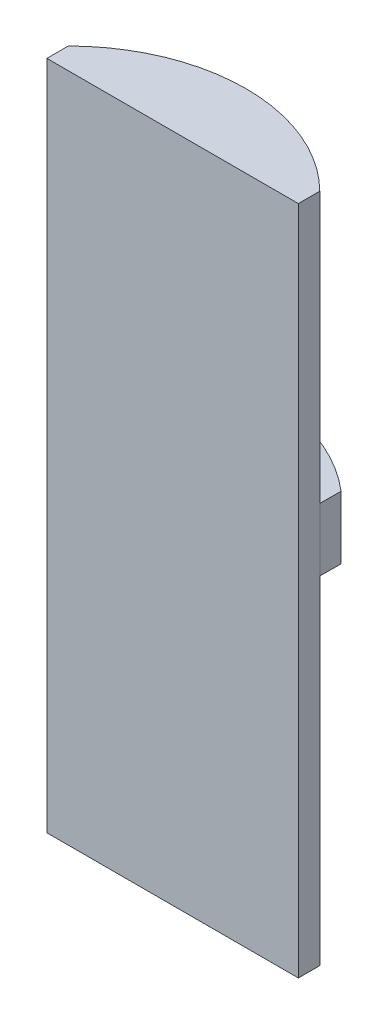
ISO-10303-21;
HEADER;
FILE_DESCRIPTION(('STEP AP214'),'2;1');
FILE_NAME('part.step','',(''),(''),'','','');
FILE_SCHEMA(('AUTOMOTIVE_DESIGN { 1 0 10303 214 1 1 1 1 }'));
ENDSEC;
DATA;
#1=APPLICATION_CONTEXT('core data for automotive mechanical design processes');
#2=APPLICATION_PROTOCOL_DEFINITION('international standard','automotive_design',2000,#1);
#3=PRODUCT_CONTEXT('',#1,'mechanical');
#4=PRODUCT('Part','Part','',(#3));
#5=PRODUCT_RELATED_PRODUCT_CATEGORY('part','',(#4));
#6=PRODUCT_DEFINITION_FORMATION('','',#4);
#7=PRODUCT_DEFINITION_CONTEXT('part definition',#1,'design');
#8=PRODUCT_DEFINITION('design','',#6,#7);
#9=PRODUCT_DEFINITION_SHAPE('','',#8);
#10=(LENGTH_UNIT() NAMED_UNIT(*) SI_UNIT(.MILLI.,.METRE.));
#11=(NAMED_UNIT(*) PLANE_ANGLE_UNIT() SI_UNIT($,.RADIAN.));
#12=(NAMED_UNIT(*) SI_UNIT($,.STERADIAN.) SOLID_ANGLE_UNIT());
#13=UNCERTAINTY_MEASURE_WITH_UNIT(LENGTH_MEASURE(1.E-05),#10,'distance_accuracy_value','');
#14=(GEOMETRIC_REPRESENTATION_CONTEXT(3) GLOBAL_UNCERTAINTY_ASSIGNED_CONTEXT((#13)) GLOBAL_UNIT_ASSIGNED_CONTEXT((#10,
#11,#12)) REPRESENTATION_CONTEXT('',''));
#15=CARTESIAN_POINT('',(0.,0.,0.));
#16=DIRECTION('',(0.,0.,1.));
#17=DIRECTION('',(1.,0.,0.));
#18=AXIS2_PLACEMENT_3D('',#15,#16,#17);
#19=CARTESIAN_POINT('',(0.,29.,0.));
#20=DIRECTION('',(0.,-1.,0.));
#21=DIRECTION('',(0.,0.,-1.));
#22=AXIS2_PLACEMENT_3D('',#19,#20,#21);
#23=CYLINDRICAL_SURFACE('',#22,8.5);
#24=CARTESIAN_POINT('',(0.,2.,0.));
#25=DIRECTION('',(0.,-1.,0.));
#26=DIRECTION('',(0.,0.,-1.));
#27=AXIS2_PLACEMENT_3D('',#24,#25,#26);
#28=CIRCLE('',#27,8.5);
#29=CARTESIAN_POINT('',(-6.,2.,-6.02079728939615));
#30=VERTEX_POINT('',#29);
#31=CARTESIAN_POINT('',(6.,2.,-6.02079728939614));
#32=VERTEX_POINT('',#31);
#33=EDGE_CURVE('E135',#30,#32,#28,.T.);
#34=ORIENTED_EDGE('',*,*,#33,.F.);
#35=DIRECTION('',(0.,-1.,0.));
#36=VECTOR('',#35,1.);
#37=CARTESIAN_POINT('',(-6.,29.,-6.02079728939615));
#38=LINE('',#37,#36);
#39=CARTESIAN_POINT('',(-6.,18.1,-6.02079728939615));
#40=VERTEX_POINT('',#39);
#41=EDGE_CURVE('E113',#40,#30,#38,.T.);
#42=ORIENTED_EDGE('',*,*,#41,.F.);
#43=CARTESIAN_POINT('',(0.,18.1,0.));
#44=DIRECTION('',(0.,-1.,0.));
#45=DIRECTION('',(0.,0.,1.));
#46=AXIS2_PLACEMENT_3D('',#43,#44,#45);
#47=CIRCLE('',#46,8.5);
#48=CARTESIAN_POINT('',(6.,18.1,-6.02079728939614));
#49=VERTEX_POINT('',#48);
#50=EDGE_CURVE('E138',#40,#49,#47,.T.);
#51=ORIENTED_EDGE('',*,*,#50,.T.);
#52=DIRECTION('',(0.,-1.,0.));
#53=VECTOR('',#52,1.);
#54=CARTESIAN_POINT('',(6.,29.,-6.02079728939614));
#55=LINE('',#54,#53);
#56=EDGE_CURVE('E166',#49,#32,#55,.T.);
#57=ORIENTED_EDGE('',*,*,#56,.T.);
#58=EDGE_LOOP('',(#34,#42,#51,#57));
#59=FACE_BOUND('',#58,.T.);
#60=ADVANCED_FACE('F40',(#59),#23,.T.);
#61=CARTESIAN_POINT('',(6.,29.,0.));
#62=DIRECTION('',(-1.,0.,0.));
#63=DIRECTION('',(0.,0.,1.));
#64=AXIS2_PLACEMENT_3D('',#61,#62,#63);
#65=PLANE('',#64);
#66=DIRECTION('',(0.,0.,1.));
#67=VECTOR('',#66,1.);
#68=CARTESIAN_POINT('',(6.,2.,0.));
#69=LINE('',#68,#67);
#70=CARTESIAN_POINT('',(6.,2.00000000000001,-5.));
#71=VERTEX_POINT('',#70);
#72=EDGE_CURVE('E54',#32,#71,#69,.T.);
#73=ORIENTED_EDGE('',*,*,#72,.F.);
#74=ORIENTED_EDGE('',*,*,#56,.F.);
#75=DIRECTION('',(0.,1.,0.));
#76=VECTOR('',#75,1.);
#77=CARTESIAN_POINT('',(6.,18.1,-6.02079728939614));
#78=LINE('',#77,#76);
#79=CARTESIAN_POINT('',(6.,21.1,-6.02079728939614));
#80=VERTEX_POINT('',#79);
#81=EDGE_CURVE('E149',#49,#80,#78,.T.);
#82=ORIENTED_EDGE('',*,*,#81,.T.);
#83=CARTESIAN_POINT('',(6.,34.,-6.02079728939614));
#84=VERTEX_POINT('',#83);
#85=EDGE_CURVE('E167',#84,#80,#55,.T.);
#86=ORIENTED_EDGE('',*,*,#85,.F.);
#87=DIRECTION('',(0.,0.,-1.));
#88=VECTOR('',#87,1.);
#89=CARTESIAN_POINT('',(6.,34.,-5.));
#90=LINE('',#89,#88);
#91=CARTESIAN_POINT('',(6.,34.,-5.));
#92=VERTEX_POINT('',#91);
#93=EDGE_CURVE('E123',#92,#84,#90,.T.);
#94=ORIENTED_EDGE('',*,*,#93,.F.);
#95=DIRECTION('',(0.,-1.,0.));
#96=VECTOR('',#95,1.);
#97=CARTESIAN_POINT('',(6.,29.,-5.));
#98=LINE('',#97,#96);
#99=EDGE_CURVE('E48',#92,#71,#98,.T.);
#100=ORIENTED_EDGE('',*,*,#99,.T.);
#101=EDGE_LOOP('',(#73,#74,#82,#86,#94,#100));
#102=FACE_BOUND('',#101,.T.);
#103=ADVANCED_FACE('F42',(#102),#65,.F.);
#104=CARTESIAN_POINT('',(-6.,29.,0.));
#105=DIRECTION('',(1.,0.,0.));
#106=DIRECTION('',(0.,0.,-1.));
#107=AXIS2_PLACEMENT_3D('',#104,#105,#106);
#108=PLANE('',#107);
#109=DIRECTION('',(0.,0.,-1.));
#110=VECTOR('',#109,1.);
#111=CARTESIAN_POINT('',(-6.,2.,0.));
#112=LINE('',#111,#110);
#113=CARTESIAN_POINT('',(-6.,2.,-5.));
#114=VERTEX_POINT('',#113);
#115=EDGE_CURVE('E111',#114,#30,#112,.T.);
#116=ORIENTED_EDGE('',*,*,#115,.F.);
#117=DIRECTION('',(0.,-1.,0.));
#118=VECTOR('',#117,1.);
#119=CARTESIAN_POINT('',(-6.,29.,-5.));
#120=LINE('',#119,#118);
#121=CARTESIAN_POINT('',(-6.,34.,-5.));
#122=VERTEX_POINT('',#121);
#123=EDGE_CURVE('E105',#122,#114,#120,.T.);
#124=ORIENTED_EDGE('',*,*,#123,.F.);
#125=DIRECTION('',(0.,0.,1.));
#126=VECTOR('',#125,1.);
#127=CARTESIAN_POINT('',(-6.,34.,-5.));
#128=LINE('',#127,#126);
#129=CARTESIAN_POINT('',(-6.,34.,-6.02079728939615));
#130=VERTEX_POINT('',#129);
#131=EDGE_CURVE('E110',#130,#122,#128,.T.);
#132=ORIENTED_EDGE('',*,*,#131,.F.);
#133=CARTESIAN_POINT('',(-6.,21.1,-6.02079728939615));
#134=VERTEX_POINT('',#133);
#135=EDGE_CURVE('E164',#130,#134,#38,.T.);
#136=ORIENTED_EDGE('',*,*,#135,.T.);
#137=DIRECTION('',(0.,0.,1.));
#138=VECTOR('',#137,1.);
#139=CARTESIAN_POINT('',(-6.,21.1,-6.02079728939615));
#140=LINE('',#139,#138);
#141=CARTESIAN_POINT('',(-6.00000000000001,21.1,-7.0400639206242));
#142=VERTEX_POINT('',#141);
#143=EDGE_CURVE('E142',#142,#134,#140,.T.);
#144=ORIENTED_EDGE('',*,*,#143,.F.);
#145=DIRECTION('',(0.,1.,0.));
#146=VECTOR('',#145,1.);
#147=CARTESIAN_POINT('',(-6.00000000000001,18.1,-7.0400639206242));
#148=LINE('',#147,#146);
#149=CARTESIAN_POINT('',(-6.00000000000001,18.1,-7.0400639206242));
#150=VERTEX_POINT('',#149);
#151=EDGE_CURVE('E114',#150,#142,#148,.T.);
#152=ORIENTED_EDGE('',*,*,#151,.F.);
#153=DIRECTION('',(0.,0.,1.));
#154=VECTOR('',#153,1.);
#155=CARTESIAN_POINT('',(-6.,18.1,-6.02079728939615));
#156=LINE('',#155,#154);
#157=EDGE_CURVE('E62',#150,#40,#156,.T.);
#158=ORIENTED_EDGE('',*,*,#157,.T.);
#159=ORIENTED_EDGE('',*,*,#41,.T.);
#160=EDGE_LOOP('',(#116,#124,#132,#136,#144,#152,#158,#159));
#161=FACE_BOUND('',#160,.T.);
#162=ADVANCED_FACE('F107',(#161),#108,.F.);
#163=CARTESIAN_POINT('',(0.,29.,-5.));
#164=DIRECTION('',(0.,0.,-1.));
#165=DIRECTION('',(-1.,0.,0.));
#166=AXIS2_PLACEMENT_3D('',#163,#164,#165);
#167=PLANE('',#166);
#168=DIRECTION('',(-1.,0.,0.));
#169=VECTOR('',#168,1.);
#170=CARTESIAN_POINT('',(0.,2.,-5.));
#171=LINE('',#170,#169);
#172=EDGE_CURVE('E11',#71,#114,#171,.T.);
#173=ORIENTED_EDGE('',*,*,#172,.F.);
#174=ORIENTED_EDGE('',*,*,#99,.F.);
#175=DIRECTION('',(1.,0.,0.));
#176=VECTOR('',#175,1.);
#177=CARTESIAN_POINT('',(-6.,34.,-5.));
#178=LINE('',#177,#176);
#179=EDGE_CURVE('E117',#122,#92,#178,.T.);
#180=ORIENTED_EDGE('',*,*,#179,.F.);
#181=ORIENTED_EDGE('',*,*,#123,.T.);
#182=EDGE_LOOP('',(#173,#174,#180,#181));
#183=FACE_BOUND('',#182,.T.);
#184=ADVANCED_FACE('F118',(#183),#167,.F.);
#185=ORIENTED_EDGE('',*,*,#85,.T.);
#186=CARTESIAN_POINT('',(0.,21.1,0.));
#187=DIRECTION('',(0.,-1.,0.));
#188=DIRECTION('',(0.,0.,1.));
#189=AXIS2_PLACEMENT_3D('',#186,#187,#188);
#190=CIRCLE('',#189,8.5);
#191=EDGE_CURVE('E137',#134,#80,#190,.T.);
#192=ORIENTED_EDGE('',*,*,#191,.F.);
#193=ORIENTED_EDGE('',*,*,#135,.F.);
#194=CARTESIAN_POINT('',(0.,34.,0.));
#195=DIRECTION('',(0.,1.,0.));
#196=DIRECTION('',(0.,0.,-1.));
#197=AXIS2_PLACEMENT_3D('',#194,#195,#196);
#198=CIRCLE('',#197,8.5);
#199=EDGE_CURVE('E128',#84,#130,#198,.T.);
#200=ORIENTED_EDGE('',*,*,#199,.F.);
#201=EDGE_LOOP('',(#185,#192,#193,#200));
#202=FACE_BOUND('',#201,.T.);
#203=ADVANCED_FACE('F173',(#202),#23,.T.);
#204=CARTESIAN_POINT('',(0.,18.1,0.));
#205=DIRECTION('',(0.,1.,0.));
#206=DIRECTION('',(0.,0.,1.));
#207=AXIS2_PLACEMENT_3D('',#204,#205,#206);
#208=CYLINDRICAL_SURFACE('',#207,9.25000000034999);
#209=CARTESIAN_POINT('',(0.,21.1,0.));
#210=DIRECTION('',(0.,1.,0.));
#211=DIRECTION('',(0.,0.,1.));
#212=AXIS2_PLACEMENT_3D('',#209,#210,#211);
#213=CIRCLE('',#212,9.25000000034999);
#214=CARTESIAN_POINT('',(6.00678751054569,21.1,-7.03427350972562));
#215=VERTEX_POINT('',#214);
#216=EDGE_CURVE('E155',#215,#142,#213,.T.);
#217=ORIENTED_EDGE('',*,*,#216,.F.);
#218=DIRECTION('',(0.,1.,0.));
#219=VECTOR('',#218,1.);
#220=CARTESIAN_POINT('',(6.00678751054569,18.1,-7.03427350972562));
#221=LINE('',#220,#219);
#222=CARTESIAN_POINT('',(6.00678751054569,18.1,-7.03427350972562));
#223=VERTEX_POINT('',#222);
#224=EDGE_CURVE('E160',#223,#215,#221,.T.);
#225=ORIENTED_EDGE('',*,*,#224,.F.);
#226=CARTESIAN_POINT('',(0.,18.1,0.));
#227=DIRECTION('',(0.,1.,0.));
#228=DIRECTION('',(0.,0.,1.));
#229=AXIS2_PLACEMENT_3D('',#226,#227,#228);
#230=CIRCLE('',#229,9.25000000034999);
#231=EDGE_CURVE('E145',#223,#150,#230,.T.);
#232=ORIENTED_EDGE('',*,*,#231,.T.);
#233=ORIENTED_EDGE('',*,*,#151,.T.);
#234=EDGE_LOOP('',(#217,#225,#232,#233));
#235=FACE_BOUND('',#234,.T.);
#236=ADVANCED_FACE('F180',(#235),#208,.T.);
#237=CARTESIAN_POINT('',(6.,18.1,-6.02079728939614));
#238=DIRECTION('',(0.999977574129832,0.,0.00669710664514347));
#239=DIRECTION('',(0.00669710664514347,0.,-0.999977574129832));
#240=AXIS2_PLACEMENT_3D('',#237,#238,#239);
#241=PLANE('',#240);
#242=DIRECTION('',(0.00669710664514347,0.,-0.999977574129832));
#243=VECTOR('',#242,1.);
#244=CARTESIAN_POINT('',(6.,21.1,-6.02079728939614));
#245=LINE('',#244,#243);
#246=EDGE_CURVE('E152',#80,#215,#245,.T.);
#247=ORIENTED_EDGE('',*,*,#246,.F.);
#248=ORIENTED_EDGE('',*,*,#81,.F.);
#249=DIRECTION('',(0.00669710664514347,0.,-0.999977574129832));
#250=VECTOR('',#249,1.);
#251=CARTESIAN_POINT('',(6.,18.1,-6.02079728939614));
#252=LINE('',#251,#250);
#253=EDGE_CURVE('E141',#49,#223,#252,.T.);
#254=ORIENTED_EDGE('',*,*,#253,.T.);
#255=ORIENTED_EDGE('',*,*,#224,.T.);
#256=EDGE_LOOP('',(#247,#248,#254,#255));
#257=FACE_BOUND('',#256,.T.);
#258=ADVANCED_FACE('F208',(#257),#241,.T.);
#259=CARTESIAN_POINT('',(0.,18.1,0.));
#260=DIRECTION('',(0.,1.,0.));
#261=DIRECTION('',(0.,0.,1.));
#262=AXIS2_PLACEMENT_3D('',#259,#260,#261);
#263=PLANE('',#262);
#264=ORIENTED_EDGE('',*,*,#50,.F.);
#265=ORIENTED_EDGE('',*,*,#157,.F.);
#266=ORIENTED_EDGE('',*,*,#231,.F.);
#267=ORIENTED_EDGE('',*,*,#253,.F.);
#268=EDGE_LOOP('',(#264,#265,#266,#267));
#269=FACE_BOUND('',#268,.T.);
#270=ADVANCED_FACE('F184',(#269),#263,.F.);
#271=CARTESIAN_POINT('',(0.,21.1,0.));
#272=DIRECTION('',(0.,1.,0.));
#273=DIRECTION('',(0.,0.,1.));
#274=AXIS2_PLACEMENT_3D('',#271,#272,#273);
#275=PLANE('',#274);
#276=ORIENTED_EDGE('',*,*,#191,.T.);
#277=ORIENTED_EDGE('',*,*,#246,.T.);
#278=ORIENTED_EDGE('',*,*,#216,.T.);
#279=ORIENTED_EDGE('',*,*,#143,.T.);
#280=EDGE_LOOP('',(#276,#277,#278,#279));
#281=FACE_BOUND('',#280,.T.);
#282=ADVANCED_FACE('F177',(#281),#275,.T.);
#283=CARTESIAN_POINT('',(0.,2.,0.));
#284=DIRECTION('',(0.,-1.,0.));
#285=DIRECTION('',(0.,0.,-1.));
#286=AXIS2_PLACEMENT_3D('',#283,#284,#285);
#287=PLANE('',#286);
#288=ORIENTED_EDGE('',*,*,#33,.T.);
#289=ORIENTED_EDGE('',*,*,#72,.T.);
#290=ORIENTED_EDGE('',*,*,#172,.T.);
#291=ORIENTED_EDGE('',*,*,#115,.T.);
#292=EDGE_LOOP('',(#288,#289,#290,#291));
#293=FACE_BOUND('',#292,.T.);
#294=ADVANCED_FACE('F188',(#293),#287,.T.);
#295=CARTESIAN_POINT('',(0.,34.,0.));
#296=DIRECTION('',(0.,-1.,0.));
#297=DIRECTION('',(0.,0.,-1.));
#298=AXIS2_PLACEMENT_3D('',#295,#296,#297);
#299=PLANE('',#298);
#300=ORIENTED_EDGE('',*,*,#131,.T.);
#301=ORIENTED_EDGE('',*,*,#179,.T.);
#302=ORIENTED_EDGE('',*,*,#93,.T.);
#303=ORIENTED_EDGE('',*,*,#199,.T.);
#304=EDGE_LOOP('',(#300,#301,#302,#303));
#305=FACE_BOUND('',#304,.T.);
#306=ADVANCED_FACE('F126',(#305),#299,.F.);
#307=CLOSED_SHELL('',(#60,#103,#162,#184,#203,#236,#258,#270,#282,#294,#306));
#308=MANIFOLD_SOLID_BREP('B2',#307);
#309=ADVANCED_BREP_SHAPE_REPRESENTATION('',(#18,#308),#14);
#310=SHAPE_DEFINITION_REPRESENTATION(#9,#309);
ENDSEC;
END-ISO-10303-21;
